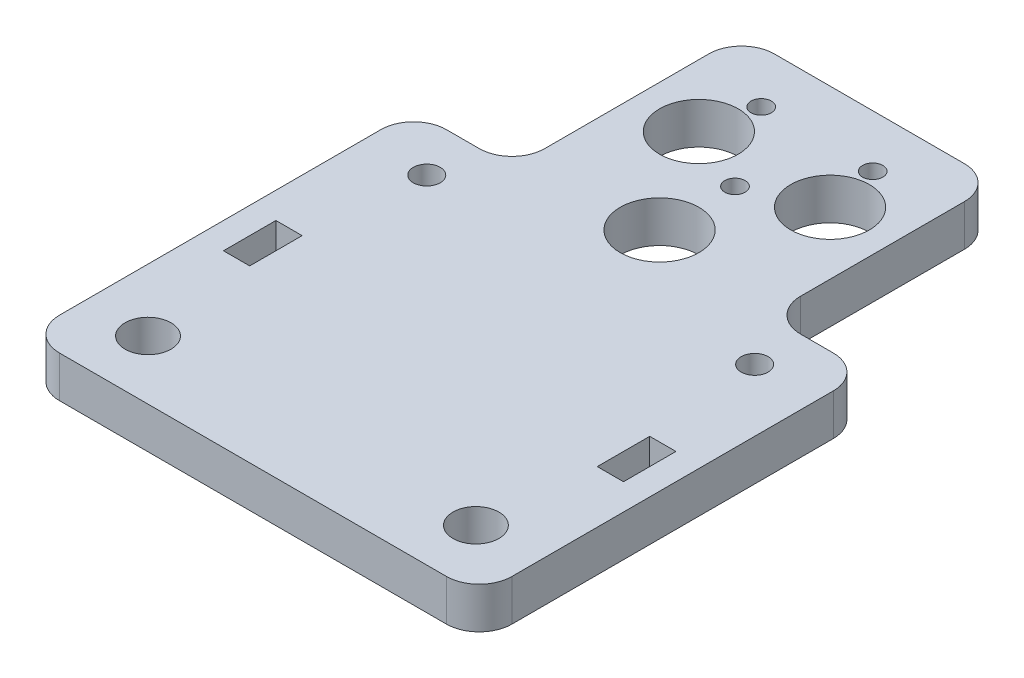
ISO-10303-21;
HEADER;
FILE_DESCRIPTION(('STEP AP214'),'2;1');
FILE_NAME('part.step','',(''),(''),'','','');
FILE_SCHEMA(('AUTOMOTIVE_DESIGN { 1 0 10303 214 1 1 1 1 }'));
ENDSEC;
DATA;
#1=APPLICATION_CONTEXT('core data for automotive mechanical design processes');
#2=APPLICATION_PROTOCOL_DEFINITION('international standard','automotive_design',2000,#1);
#3=PRODUCT_CONTEXT('',#1,'mechanical');
#4=PRODUCT('Part','Part','',(#3));
#5=PRODUCT_RELATED_PRODUCT_CATEGORY('part','',(#4));
#6=PRODUCT_DEFINITION_FORMATION('','',#4);
#7=PRODUCT_DEFINITION_CONTEXT('part definition',#1,'design');
#8=PRODUCT_DEFINITION('design','',#6,#7);
#9=PRODUCT_DEFINITION_SHAPE('','',#8);
#10=(LENGTH_UNIT() NAMED_UNIT(*) SI_UNIT(.MILLI.,.METRE.));
#11=(NAMED_UNIT(*) PLANE_ANGLE_UNIT() SI_UNIT($,.RADIAN.));
#12=(NAMED_UNIT(*) SI_UNIT($,.STERADIAN.) SOLID_ANGLE_UNIT());
#13=UNCERTAINTY_MEASURE_WITH_UNIT(LENGTH_MEASURE(1.E-05),#10,'distance_accuracy_value','');
#14=(GEOMETRIC_REPRESENTATION_CONTEXT(3) GLOBAL_UNCERTAINTY_ASSIGNED_CONTEXT((#13)) GLOBAL_UNIT_ASSIGNED_CONTEXT((#10,
#11,#12)) REPRESENTATION_CONTEXT('',''));
#15=CARTESIAN_POINT('',(0.,0.,0.));
#16=DIRECTION('',(0.,0.,1.));
#17=DIRECTION('',(1.,0.,0.));
#18=AXIS2_PLACEMENT_3D('',#15,#16,#17);
#19=CARTESIAN_POINT('',(0.,6.3,0.));
#20=DIRECTION('',(0.,1.,0.));
#21=DIRECTION('',(0.,0.,1.));
#22=AXIS2_PLACEMENT_3D('',#19,#20,#21);
#23=PLANE('',#22);
#24=CARTESIAN_POINT('',(26.,6.3,-86.));
#25=DIRECTION('',(0.,1.,0.));
#26=DIRECTION('',(0.,0.,1.));
#27=AXIS2_PLACEMENT_3D('',#24,#25,#26);
#28=CIRCLE('',#27,1.55);
#29=CARTESIAN_POINT('',(26.,6.3,-84.45));
#30=VERTEX_POINT('',#29);
#31=EDGE_CURVE('E830',#30,#30,#28,.T.);
#32=ORIENTED_EDGE('',*,*,#31,.F.);
#33=EDGE_LOOP('',(#32));
#34=FACE_BOUND('',#33,.T.);
#35=CARTESIAN_POINT('',(34.5,6.3,-62.));
#36=DIRECTION('',(0.,1.,0.));
#37=DIRECTION('',(0.,0.,1.));
#38=AXIS2_PLACEMENT_3D('',#35,#36,#37);
#39=CIRCLE('',#38,6.);
#40=CARTESIAN_POINT('',(34.5,6.3,-56.));
#41=VERTEX_POINT('',#40);
#42=EDGE_CURVE('E838',#41,#41,#39,.T.);
#43=ORIENTED_EDGE('',*,*,#42,.F.);
#44=EDGE_LOOP('',(#43));
#45=FACE_BOUND('',#44,.T.);
#46=CARTESIAN_POINT('',(24.5,6.3,-78.));
#47=DIRECTION('',(0.,1.,0.));
#48=DIRECTION('',(0.,0.,1.));
#49=AXIS2_PLACEMENT_3D('',#46,#47,#48);
#50=CIRCLE('',#49,6.);
#51=CARTESIAN_POINT('',(24.5,6.3,-72.));
#52=VERTEX_POINT('',#51);
#53=EDGE_CURVE('E846',#52,#52,#50,.T.);
#54=ORIENTED_EDGE('',*,*,#53,.F.);
#55=EDGE_LOOP('',(#54));
#56=FACE_BOUND('',#55,.T.);
#57=CARTESIAN_POINT('',(9.5,6.3,-9.));
#58=DIRECTION('',(0.,1.,0.));
#59=DIRECTION('',(0.,0.,1.));
#60=AXIS2_PLACEMENT_3D('',#57,#58,#59);
#61=CIRCLE('',#60,3.5);
#62=CARTESIAN_POINT('',(9.5,6.3,-5.5));
#63=VERTEX_POINT('',#62);
#64=EDGE_CURVE('E854',#63,#63,#61,.T.);
#65=ORIENTED_EDGE('',*,*,#64,.F.);
#66=EDGE_LOOP('',(#65));
#67=FACE_BOUND('',#66,.T.);
#68=CARTESIAN_POINT('',(9.5,6.3,-51.5));
#69=DIRECTION('',(0.,1.,0.));
#70=DIRECTION('',(0.,0.,1.));
#71=AXIS2_PLACEMENT_3D('',#68,#69,#70);
#72=CIRCLE('',#71,2.05);
#73=CARTESIAN_POINT('',(9.5,6.3,-49.45));
#74=VERTEX_POINT('',#73);
#75=EDGE_CURVE('E228',#74,#74,#72,.T.);
#76=ORIENTED_EDGE('',*,*,#75,.F.);
#77=EDGE_LOOP('',(#76));
#78=FACE_BOUND('',#77,.T.);
#79=DIRECTION('',(1.,0.,0.));
#80=VECTOR('',#79,1.);
#81=CARTESIAN_POINT('',(0.,6.3,0.));
#82=LINE('',#81,#80);
#83=CARTESIAN_POINT('',(5.,6.3,0.));
#84=VERTEX_POINT('',#83);
#85=CARTESIAN_POINT('',(64.,6.3,0.));
#86=VERTEX_POINT('',#85);
#87=EDGE_CURVE('E273',#84,#86,#82,.T.);
#88=ORIENTED_EDGE('',*,*,#87,.T.);
#89=CARTESIAN_POINT('',(64.,6.3,-5.));
#90=DIRECTION('',(0.,1.,0.));
#91=DIRECTION('',(0.,0.,1.));
#92=AXIS2_PLACEMENT_3D('',#89,#90,#91);
#93=CIRCLE('',#92,5.);
#94=CARTESIAN_POINT('',(69.,6.3,-5.));
#95=VERTEX_POINT('',#94);
#96=EDGE_CURVE('E356',#86,#95,#93,.T.);
#97=ORIENTED_EDGE('',*,*,#96,.T.);
#98=DIRECTION('',(0.,0.,-1.));
#99=VECTOR('',#98,1.);
#100=CARTESIAN_POINT('',(69.,6.3,0.));
#101=LINE('',#100,#99);
#102=CARTESIAN_POINT('',(69.,6.3,-54.));
#103=VERTEX_POINT('',#102);
#104=EDGE_CURVE('E277',#95,#103,#101,.T.);
#105=ORIENTED_EDGE('',*,*,#104,.T.);
#106=CARTESIAN_POINT('',(64.,6.3,-54.));
#107=DIRECTION('',(0.,1.,0.));
#108=DIRECTION('',(0.,0.,1.));
#109=AXIS2_PLACEMENT_3D('',#106,#107,#108);
#110=CIRCLE('',#109,5.);
#111=CARTESIAN_POINT('',(64.,6.3,-59.));
#112=VERTEX_POINT('',#111);
#113=EDGE_CURVE('E354',#103,#112,#110,.T.);
#114=ORIENTED_EDGE('',*,*,#113,.T.);
#115=DIRECTION('',(-1.,0.,0.));
#116=VECTOR('',#115,1.);
#117=CARTESIAN_POINT('',(54.,6.3,-59.));
#118=LINE('',#117,#116);
#119=CARTESIAN_POINT('',(59.,6.3,-59.));
#120=VERTEX_POINT('',#119);
#121=EDGE_CURVE('E280',#112,#120,#118,.T.);
#122=ORIENTED_EDGE('',*,*,#121,.T.);
#123=CARTESIAN_POINT('',(59.,6.3,-64.));
#124=DIRECTION('',(0.,1.,0.));
#125=DIRECTION('',(0.,0.,1.));
#126=AXIS2_PLACEMENT_3D('',#123,#124,#125);
#127=CIRCLE('',#126,5.);
#128=CARTESIAN_POINT('',(54.,6.3,-64.));
#129=VERTEX_POINT('',#128);
#130=EDGE_CURVE('E379',#120,#129,#127,.F.);
#131=ORIENTED_EDGE('',*,*,#130,.T.);
#132=DIRECTION('',(0.,0.,-1.));
#133=VECTOR('',#132,1.);
#134=CARTESIAN_POINT('',(54.,6.3,-94.));
#135=LINE('',#134,#133);
#136=CARTESIAN_POINT('',(54.,6.3,-89.));
#137=VERTEX_POINT('',#136);
#138=EDGE_CURVE('E283',#129,#137,#135,.T.);
#139=ORIENTED_EDGE('',*,*,#138,.T.);
#140=CARTESIAN_POINT('',(49.,6.3,-89.));
#141=DIRECTION('',(0.,1.,0.));
#142=DIRECTION('',(0.,0.,1.));
#143=AXIS2_PLACEMENT_3D('',#140,#141,#142);
#144=CIRCLE('',#143,5.);
#145=CARTESIAN_POINT('',(49.,6.3,-94.));
#146=VERTEX_POINT('',#145);
#147=EDGE_CURVE('E352',#137,#146,#144,.T.);
#148=ORIENTED_EDGE('',*,*,#147,.T.);
#149=DIRECTION('',(-1.,0.,0.));
#150=VECTOR('',#149,1.);
#151=CARTESIAN_POINT('',(15.,6.3,-94.));
#152=LINE('',#151,#150);
#153=CARTESIAN_POINT('',(20.,6.3,-94.));
#154=VERTEX_POINT('',#153);
#155=EDGE_CURVE('E286',#146,#154,#152,.T.);
#156=ORIENTED_EDGE('',*,*,#155,.T.);
#157=CARTESIAN_POINT('',(20.,6.3,-89.));
#158=DIRECTION('',(0.,1.,0.));
#159=DIRECTION('',(0.,0.,1.));
#160=AXIS2_PLACEMENT_3D('',#157,#158,#159);
#161=CIRCLE('',#160,5.);
#162=CARTESIAN_POINT('',(15.,6.3,-89.));
#163=VERTEX_POINT('',#162);
#164=EDGE_CURVE('E350',#154,#163,#161,.T.);
#165=ORIENTED_EDGE('',*,*,#164,.T.);
#166=DIRECTION('',(0.,0.,1.));
#167=VECTOR('',#166,1.);
#168=CARTESIAN_POINT('',(15.,6.3,-94.));
#169=LINE('',#168,#167);
#170=CARTESIAN_POINT('',(15.,6.3,-64.));
#171=VERTEX_POINT('',#170);
#172=EDGE_CURVE('E289',#163,#171,#169,.T.);
#173=ORIENTED_EDGE('',*,*,#172,.T.);
#174=CARTESIAN_POINT('',(10.,6.3,-64.));
#175=DIRECTION('',(0.,1.,0.));
#176=DIRECTION('',(0.,0.,1.));
#177=AXIS2_PLACEMENT_3D('',#174,#175,#176);
#178=CIRCLE('',#177,5.);
#179=CARTESIAN_POINT('',(10.,6.3,-59.));
#180=VERTEX_POINT('',#179);
#181=EDGE_CURVE('E11',#171,#180,#178,.F.);
#182=ORIENTED_EDGE('',*,*,#181,.T.);
#183=DIRECTION('',(-1.,0.,0.));
#184=VECTOR('',#183,1.);
#185=CARTESIAN_POINT('',(15.,6.3,-59.));
#186=LINE('',#185,#184);
#187=CARTESIAN_POINT('',(5.,6.3,-59.));
#188=VERTEX_POINT('',#187);
#189=EDGE_CURVE('E291',#180,#188,#186,.T.);
#190=ORIENTED_EDGE('',*,*,#189,.T.);
#191=CARTESIAN_POINT('',(5.,6.3,-54.));
#192=DIRECTION('',(0.,1.,0.));
#193=DIRECTION('',(0.,0.,1.));
#194=AXIS2_PLACEMENT_3D('',#191,#192,#193);
#195=CIRCLE('',#194,5.);
#196=CARTESIAN_POINT('',(0.,6.3,-54.));
#197=VERTEX_POINT('',#196);
#198=EDGE_CURVE('E348',#188,#197,#195,.T.);
#199=ORIENTED_EDGE('',*,*,#198,.T.);
#200=DIRECTION('',(0.,0.,1.));
#201=VECTOR('',#200,1.);
#202=CARTESIAN_POINT('',(0.,6.3,0.));
#203=LINE('',#202,#201);
#204=CARTESIAN_POINT('',(0.,6.3,-5.));
#205=VERTEX_POINT('',#204);
#206=EDGE_CURVE('E270',#197,#205,#203,.T.);
#207=ORIENTED_EDGE('',*,*,#206,.T.);
#208=CARTESIAN_POINT('',(5.,6.3,-5.));
#209=DIRECTION('',(0.,1.,0.));
#210=DIRECTION('',(0.,0.,1.));
#211=AXIS2_PLACEMENT_3D('',#208,#209,#210);
#212=CIRCLE('',#211,5.);
#213=EDGE_CURVE('E346',#205,#84,#212,.T.);
#214=ORIENTED_EDGE('',*,*,#213,.T.);
#215=EDGE_LOOP('',(#88,#97,#105,#114,#122,#131,#139,#148,#156,#165,#173,#182,#190,#199,#207,#214));
#216=FACE_BOUND('',#215,.T.);
#217=DIRECTION('',(1.,0.,0.));
#218=VECTOR('',#217,1.);
#219=CARTESIAN_POINT('',(4.,6.3,-26.));
#220=LINE('',#219,#218);
#221=CARTESIAN_POINT('',(4.,6.3,-26.));
#222=VERTEX_POINT('',#221);
#223=CARTESIAN_POINT('',(8.,6.3,-26.));
#224=VERTEX_POINT('',#223);
#225=EDGE_CURVE('E241',#222,#224,#220,.T.);
#226=ORIENTED_EDGE('',*,*,#225,.F.);
#227=DIRECTION('',(0.,0.,1.));
#228=VECTOR('',#227,1.);
#229=CARTESIAN_POINT('',(4.,6.3,-34.));
#230=LINE('',#229,#228);
#231=CARTESIAN_POINT('',(4.,6.3,-34.));
#232=VERTEX_POINT('',#231);
#233=EDGE_CURVE('E239',#232,#222,#230,.T.);
#234=ORIENTED_EDGE('',*,*,#233,.F.);
#235=DIRECTION('',(-1.,0.,0.));
#236=VECTOR('',#235,1.);
#237=CARTESIAN_POINT('',(4.,6.3,-34.));
#238=LINE('',#237,#236);
#239=CARTESIAN_POINT('',(8.,6.3,-34.));
#240=VERTEX_POINT('',#239);
#241=EDGE_CURVE('E247',#240,#232,#238,.T.);
#242=ORIENTED_EDGE('',*,*,#241,.F.);
#243=DIRECTION('',(0.,0.,-1.));
#244=VECTOR('',#243,1.);
#245=CARTESIAN_POINT('',(8.,6.3,-34.));
#246=LINE('',#245,#244);
#247=EDGE_CURVE('E244',#224,#240,#246,.T.);
#248=ORIENTED_EDGE('',*,*,#247,.F.);
#249=EDGE_LOOP('',(#226,#234,#242,#248));
#250=FACE_BOUND('',#249,.T.);
#251=DIRECTION('',(-1.,0.,0.));
#252=VECTOR('',#251,1.);
#253=CARTESIAN_POINT('',(65.,6.3,-34.));
#254=LINE('',#253,#252);
#255=CARTESIAN_POINT('',(65.,6.3,-34.));
#256=VERTEX_POINT('',#255);
#257=CARTESIAN_POINT('',(61.,6.3,-34.));
#258=VERTEX_POINT('',#257);
#259=EDGE_CURVE('E205',#256,#258,#254,.T.);
#260=ORIENTED_EDGE('',*,*,#259,.F.);
#261=DIRECTION('',(0.,0.,-1.));
#262=VECTOR('',#261,1.);
#263=CARTESIAN_POINT('',(65.,6.3,-34.));
#264=LINE('',#263,#262);
#265=CARTESIAN_POINT('',(65.,6.3,-26.));
#266=VERTEX_POINT('',#265);
#267=EDGE_CURVE('E195',#266,#256,#264,.T.);
#268=ORIENTED_EDGE('',*,*,#267,.F.);
#269=DIRECTION('',(1.,0.,0.));
#270=VECTOR('',#269,1.);
#271=CARTESIAN_POINT('',(65.,6.3,-26.));
#272=LINE('',#271,#270);
#273=CARTESIAN_POINT('',(61.,6.3,-26.));
#274=VERTEX_POINT('',#273);
#275=EDGE_CURVE('E221',#274,#266,#272,.T.);
#276=ORIENTED_EDGE('',*,*,#275,.F.);
#277=DIRECTION('',(0.,0.,1.));
#278=VECTOR('',#277,1.);
#279=CARTESIAN_POINT('',(61.,6.3,-34.));
#280=LINE('',#279,#278);
#281=EDGE_CURVE('E219',#258,#274,#280,.T.);
#282=ORIENTED_EDGE('',*,*,#281,.F.);
#283=EDGE_LOOP('',(#260,#268,#276,#282));
#284=FACE_BOUND('',#283,.T.);
#285=CARTESIAN_POINT('',(59.5,6.3,-51.5));
#286=DIRECTION('',(0.,1.,0.));
#287=DIRECTION('',(0.,0.,1.));
#288=AXIS2_PLACEMENT_3D('',#285,#286,#287);
#289=CIRCLE('',#288,2.04999999999999);
#290=CARTESIAN_POINT('',(59.5,6.3,-49.45));
#291=VERTEX_POINT('',#290);
#292=EDGE_CURVE('E858',#291,#291,#289,.T.);
#293=ORIENTED_EDGE('',*,*,#292,.F.);
#294=EDGE_LOOP('',(#293));
#295=FACE_BOUND('',#294,.T.);
#296=CARTESIAN_POINT('',(59.5,6.3,-9.));
#297=DIRECTION('',(0.,1.,0.));
#298=DIRECTION('',(0.,0.,1.));
#299=AXIS2_PLACEMENT_3D('',#296,#297,#298);
#300=CIRCLE('',#299,3.50000000000001);
#301=CARTESIAN_POINT('',(59.5,6.3,-5.49999999999999));
#302=VERTEX_POINT('',#301);
#303=EDGE_CURVE('E850',#302,#302,#300,.T.);
#304=ORIENTED_EDGE('',*,*,#303,.F.);
#305=EDGE_LOOP('',(#304));
#306=FACE_BOUND('',#305,.T.);
#307=CARTESIAN_POINT('',(44.5,6.3,-78.));
#308=DIRECTION('',(0.,1.,0.));
#309=DIRECTION('',(0.,0.,1.));
#310=AXIS2_PLACEMENT_3D('',#307,#308,#309);
#311=CIRCLE('',#310,6.);
#312=CARTESIAN_POINT('',(44.5,6.3,-72.));
#313=VERTEX_POINT('',#312);
#314=EDGE_CURVE('E842',#313,#313,#311,.T.);
#315=ORIENTED_EDGE('',*,*,#314,.F.);
#316=EDGE_LOOP('',(#315));
#317=FACE_BOUND('',#316,.T.);
#318=CARTESIAN_POINT('',(34.5,6.3,-73.5));
#319=DIRECTION('',(0.,1.,0.));
#320=DIRECTION('',(0.,0.,1.));
#321=AXIS2_PLACEMENT_3D('',#318,#319,#320);
#322=CIRCLE('',#321,1.55);
#323=CARTESIAN_POINT('',(34.5,6.3,-71.95));
#324=VERTEX_POINT('',#323);
#325=EDGE_CURVE('E834',#324,#324,#322,.T.);
#326=ORIENTED_EDGE('',*,*,#325,.F.);
#327=EDGE_LOOP('',(#326));
#328=FACE_BOUND('',#327,.T.);
#329=CARTESIAN_POINT('',(43.,6.3,-86.));
#330=DIRECTION('',(0.,1.,0.));
#331=DIRECTION('',(0.,0.,1.));
#332=AXIS2_PLACEMENT_3D('',#329,#330,#331);
#333=CIRCLE('',#332,1.55);
#334=CARTESIAN_POINT('',(43.,6.3,-84.45));
#335=VERTEX_POINT('',#334);
#336=EDGE_CURVE('E825',#335,#335,#333,.T.);
#337=ORIENTED_EDGE('',*,*,#336,.F.);
#338=EDGE_LOOP('',(#337));
#339=FACE_BOUND('',#338,.T.);
#340=ADVANCED_FACE('F33',(#34,#45,#56,#67,#78,#216,#250,#284,#295,#306,#317,#328,#339),#23,.T.);
#341=CARTESIAN_POINT('',(0.,0.,0.));
#342=DIRECTION('',(0.,1.,0.));
#343=DIRECTION('',(0.,0.,1.));
#344=AXIS2_PLACEMENT_3D('',#341,#342,#343);
#345=PLANE('',#344);
#346=DIRECTION('',(0.,0.,1.));
#347=VECTOR('',#346,1.);
#348=CARTESIAN_POINT('',(4.,0.,-34.));
#349=LINE('',#348,#347);
#350=CARTESIAN_POINT('',(4.,0.,-34.));
#351=VERTEX_POINT('',#350);
#352=CARTESIAN_POINT('',(4.,0.,-26.));
#353=VERTEX_POINT('',#352);
#354=EDGE_CURVE('E213',#351,#353,#349,.T.);
#355=ORIENTED_EDGE('',*,*,#354,.T.);
#356=DIRECTION('',(1.,0.,0.));
#357=VECTOR('',#356,1.);
#358=CARTESIAN_POINT('',(4.,0.,-26.));
#359=LINE('',#358,#357);
#360=CARTESIAN_POINT('',(8.,0.,-26.));
#361=VERTEX_POINT('',#360);
#362=EDGE_CURVE('E252',#353,#361,#359,.T.);
#363=ORIENTED_EDGE('',*,*,#362,.T.);
#364=DIRECTION('',(0.,0.,-1.));
#365=VECTOR('',#364,1.);
#366=CARTESIAN_POINT('',(8.,0.,-34.));
#367=LINE('',#366,#365);
#368=CARTESIAN_POINT('',(8.,0.,-34.));
#369=VERTEX_POINT('',#368);
#370=EDGE_CURVE('E255',#361,#369,#367,.T.);
#371=ORIENTED_EDGE('',*,*,#370,.T.);
#372=DIRECTION('',(-1.,0.,0.));
#373=VECTOR('',#372,1.);
#374=CARTESIAN_POINT('',(4.,0.,-34.));
#375=LINE('',#374,#373);
#376=EDGE_CURVE('E242',#369,#351,#375,.T.);
#377=ORIENTED_EDGE('',*,*,#376,.T.);
#378=EDGE_LOOP('',(#355,#363,#371,#377));
#379=FACE_BOUND('',#378,.T.);
#380=DIRECTION('',(0.,0.,-1.));
#381=VECTOR('',#380,1.);
#382=CARTESIAN_POINT('',(69.,0.,0.));
#383=LINE('',#382,#381);
#384=CARTESIAN_POINT('',(69.,0.,-5.));
#385=VERTEX_POINT('',#384);
#386=CARTESIAN_POINT('',(69.,0.,-54.));
#387=VERTEX_POINT('',#386);
#388=EDGE_CURVE('E299',#385,#387,#383,.T.);
#389=ORIENTED_EDGE('',*,*,#388,.F.);
#390=CARTESIAN_POINT('',(64.,0.,-5.));
#391=DIRECTION('',(0.,1.,0.));
#392=DIRECTION('',(0.,0.,1.));
#393=AXIS2_PLACEMENT_3D('',#390,#391,#392);
#394=CIRCLE('',#393,5.);
#395=CARTESIAN_POINT('',(64.,0.,0.));
#396=VERTEX_POINT('',#395);
#397=EDGE_CURVE('E339',#385,#396,#394,.F.);
#398=ORIENTED_EDGE('',*,*,#397,.T.);
#399=DIRECTION('',(1.,0.,0.));
#400=VECTOR('',#399,1.);
#401=CARTESIAN_POINT('',(0.,0.,0.));
#402=LINE('',#401,#400);
#403=CARTESIAN_POINT('',(5.,0.,0.));
#404=VERTEX_POINT('',#403);
#405=EDGE_CURVE('E296',#404,#396,#402,.T.);
#406=ORIENTED_EDGE('',*,*,#405,.F.);
#407=CARTESIAN_POINT('',(5.,0.,-5.));
#408=DIRECTION('',(0.,1.,0.));
#409=DIRECTION('',(0.,0.,1.));
#410=AXIS2_PLACEMENT_3D('',#407,#408,#409);
#411=CIRCLE('',#410,5.);
#412=CARTESIAN_POINT('',(0.,0.,-5.));
#413=VERTEX_POINT('',#412);
#414=EDGE_CURVE('E329',#404,#413,#411,.F.);
#415=ORIENTED_EDGE('',*,*,#414,.T.);
#416=DIRECTION('',(0.,0.,1.));
#417=VECTOR('',#416,1.);
#418=CARTESIAN_POINT('',(0.,0.,0.));
#419=LINE('',#418,#417);
#420=CARTESIAN_POINT('',(0.,0.,-54.));
#421=VERTEX_POINT('',#420);
#422=EDGE_CURVE('E269',#421,#413,#419,.T.);
#423=ORIENTED_EDGE('',*,*,#422,.F.);
#424=CARTESIAN_POINT('',(5.,0.,-54.));
#425=DIRECTION('',(0.,1.,0.));
#426=DIRECTION('',(0.,0.,1.));
#427=AXIS2_PLACEMENT_3D('',#424,#425,#426);
#428=CIRCLE('',#427,5.);
#429=CARTESIAN_POINT('',(5.,0.,-59.));
#430=VERTEX_POINT('',#429);
#431=EDGE_CURVE('E331',#421,#430,#428,.F.);
#432=ORIENTED_EDGE('',*,*,#431,.T.);
#433=DIRECTION('',(-1.,0.,0.));
#434=VECTOR('',#433,1.);
#435=CARTESIAN_POINT('',(15.,0.,-59.));
#436=LINE('',#435,#434);
#437=CARTESIAN_POINT('',(10.,0.,-59.));
#438=VERTEX_POINT('',#437);
#439=EDGE_CURVE('E274',#438,#430,#436,.T.);
#440=ORIENTED_EDGE('',*,*,#439,.F.);
#441=CARTESIAN_POINT('',(10.,0.,-64.));
#442=DIRECTION('',(0.,1.,0.));
#443=DIRECTION('',(0.,0.,1.));
#444=AXIS2_PLACEMENT_3D('',#441,#442,#443);
#445=CIRCLE('',#444,5.);
#446=CARTESIAN_POINT('',(15.,0.,-64.));
#447=VERTEX_POINT('',#446);
#448=EDGE_CURVE('E41',#438,#447,#445,.T.);
#449=ORIENTED_EDGE('',*,*,#448,.T.);
#450=DIRECTION('',(0.,0.,1.));
#451=VECTOR('',#450,1.);
#452=CARTESIAN_POINT('',(15.,0.,-94.));
#453=LINE('',#452,#451);
#454=CARTESIAN_POINT('',(15.,0.,-89.));
#455=VERTEX_POINT('',#454);
#456=EDGE_CURVE('E311',#455,#447,#453,.T.);
#457=ORIENTED_EDGE('',*,*,#456,.F.);
#458=CARTESIAN_POINT('',(20.,0.,-89.));
#459=DIRECTION('',(0.,1.,0.));
#460=DIRECTION('',(0.,0.,1.));
#461=AXIS2_PLACEMENT_3D('',#458,#459,#460);
#462=CIRCLE('',#461,5.);
#463=CARTESIAN_POINT('',(20.,0.,-94.));
#464=VERTEX_POINT('',#463);
#465=EDGE_CURVE('E333',#455,#464,#462,.F.);
#466=ORIENTED_EDGE('',*,*,#465,.T.);
#467=DIRECTION('',(-1.,0.,0.));
#468=VECTOR('',#467,1.);
#469=CARTESIAN_POINT('',(15.,0.,-94.));
#470=LINE('',#469,#468);
#471=CARTESIAN_POINT('',(49.,0.,-94.));
#472=VERTEX_POINT('',#471);
#473=EDGE_CURVE('E308',#472,#464,#470,.T.);
#474=ORIENTED_EDGE('',*,*,#473,.F.);
#475=CARTESIAN_POINT('',(49.,0.,-89.));
#476=DIRECTION('',(0.,1.,0.));
#477=DIRECTION('',(0.,0.,1.));
#478=AXIS2_PLACEMENT_3D('',#475,#476,#477);
#479=CIRCLE('',#478,5.);
#480=CARTESIAN_POINT('',(54.,0.,-89.));
#481=VERTEX_POINT('',#480);
#482=EDGE_CURVE('E335',#472,#481,#479,.F.);
#483=ORIENTED_EDGE('',*,*,#482,.T.);
#484=DIRECTION('',(0.,0.,-1.));
#485=VECTOR('',#484,1.);
#486=CARTESIAN_POINT('',(54.,0.,-94.));
#487=LINE('',#486,#485);
#488=CARTESIAN_POINT('',(54.,0.,-64.));
#489=VERTEX_POINT('',#488);
#490=EDGE_CURVE('E305',#489,#481,#487,.T.);
#491=ORIENTED_EDGE('',*,*,#490,.F.);
#492=CARTESIAN_POINT('',(59.,0.,-64.));
#493=DIRECTION('',(0.,1.,0.));
#494=DIRECTION('',(0.,0.,1.));
#495=AXIS2_PLACEMENT_3D('',#492,#493,#494);
#496=CIRCLE('',#495,5.);
#497=CARTESIAN_POINT('',(59.,0.,-59.));
#498=VERTEX_POINT('',#497);
#499=EDGE_CURVE('E377',#489,#498,#496,.T.);
#500=ORIENTED_EDGE('',*,*,#499,.T.);
#501=DIRECTION('',(-1.,0.,0.));
#502=VECTOR('',#501,1.);
#503=CARTESIAN_POINT('',(54.,0.,-59.));
#504=LINE('',#503,#502);
#505=CARTESIAN_POINT('',(64.,0.,-59.));
#506=VERTEX_POINT('',#505);
#507=EDGE_CURVE('E302',#506,#498,#504,.T.);
#508=ORIENTED_EDGE('',*,*,#507,.F.);
#509=CARTESIAN_POINT('',(64.,0.,-54.));
#510=DIRECTION('',(0.,1.,0.));
#511=DIRECTION('',(0.,0.,1.));
#512=AXIS2_PLACEMENT_3D('',#509,#510,#511);
#513=CIRCLE('',#512,5.);
#514=EDGE_CURVE('E337',#506,#387,#513,.F.);
#515=ORIENTED_EDGE('',*,*,#514,.T.);
#516=EDGE_LOOP('',(#389,#398,#406,#415,#423,#432,#440,#449,#457,#466,#474,#483,#491,#500,#508,#515));
#517=FACE_BOUND('',#516,.T.);
#518=DIRECTION('',(0.,0.,-1.));
#519=VECTOR('',#518,1.);
#520=CARTESIAN_POINT('',(65.,0.,-34.));
#521=LINE('',#520,#519);
#522=CARTESIAN_POINT('',(65.,0.,-26.));
#523=VERTEX_POINT('',#522);
#524=CARTESIAN_POINT('',(65.,0.,-34.));
#525=VERTEX_POINT('',#524);
#526=EDGE_CURVE('E226',#523,#525,#521,.T.);
#527=ORIENTED_EDGE('',*,*,#526,.T.);
#528=DIRECTION('',(-1.,0.,0.));
#529=VECTOR('',#528,1.);
#530=CARTESIAN_POINT('',(65.,0.,-34.));
#531=LINE('',#530,#529);
#532=CARTESIAN_POINT('',(61.,0.,-34.));
#533=VERTEX_POINT('',#532);
#534=EDGE_CURVE('E212',#525,#533,#531,.T.);
#535=ORIENTED_EDGE('',*,*,#534,.T.);
#536=DIRECTION('',(0.,0.,1.));
#537=VECTOR('',#536,1.);
#538=CARTESIAN_POINT('',(61.,0.,-34.));
#539=LINE('',#538,#537);
#540=CARTESIAN_POINT('',(61.,0.,-26.));
#541=VERTEX_POINT('',#540);
#542=EDGE_CURVE('E230',#533,#541,#539,.T.);
#543=ORIENTED_EDGE('',*,*,#542,.T.);
#544=DIRECTION('',(1.,0.,0.));
#545=VECTOR('',#544,1.);
#546=CARTESIAN_POINT('',(65.,0.,-26.));
#547=LINE('',#546,#545);
#548=EDGE_CURVE('E206',#541,#523,#547,.T.);
#549=ORIENTED_EDGE('',*,*,#548,.T.);
#550=EDGE_LOOP('',(#527,#535,#543,#549));
#551=FACE_BOUND('',#550,.T.);
#552=CARTESIAN_POINT('',(9.5,0.,-51.5));
#553=DIRECTION('',(0.,1.,0.));
#554=DIRECTION('',(0.,0.,1.));
#555=AXIS2_PLACEMENT_3D('',#552,#553,#554);
#556=CIRCLE('',#555,2.05);
#557=CARTESIAN_POINT('',(9.5,0.,-49.45));
#558=VERTEX_POINT('',#557);
#559=EDGE_CURVE('E788',#558,#558,#556,.T.);
#560=ORIENTED_EDGE('',*,*,#559,.T.);
#561=EDGE_LOOP('',(#560));
#562=FACE_BOUND('',#561,.T.);
#563=CARTESIAN_POINT('',(59.5,0.,-51.5));
#564=DIRECTION('',(0.,1.,0.));
#565=DIRECTION('',(0.,0.,1.));
#566=AXIS2_PLACEMENT_3D('',#563,#564,#565);
#567=CIRCLE('',#566,2.04999999999999);
#568=CARTESIAN_POINT('',(59.5,0.,-49.45));
#569=VERTEX_POINT('',#568);
#570=EDGE_CURVE('E792',#569,#569,#567,.T.);
#571=ORIENTED_EDGE('',*,*,#570,.T.);
#572=EDGE_LOOP('',(#571));
#573=FACE_BOUND('',#572,.T.);
#574=CARTESIAN_POINT('',(9.5,0.,-9.));
#575=DIRECTION('',(0.,1.,0.));
#576=DIRECTION('',(0.,0.,1.));
#577=AXIS2_PLACEMENT_3D('',#574,#575,#576);
#578=CIRCLE('',#577,3.5);
#579=CARTESIAN_POINT('',(9.5,0.,-5.5));
#580=VERTEX_POINT('',#579);
#581=EDGE_CURVE('E796',#580,#580,#578,.T.);
#582=ORIENTED_EDGE('',*,*,#581,.T.);
#583=EDGE_LOOP('',(#582));
#584=FACE_BOUND('',#583,.T.);
#585=CARTESIAN_POINT('',(59.5,0.,-9.));
#586=DIRECTION('',(0.,1.,0.));
#587=DIRECTION('',(0.,0.,1.));
#588=AXIS2_PLACEMENT_3D('',#585,#586,#587);
#589=CIRCLE('',#588,3.50000000000001);
#590=CARTESIAN_POINT('',(59.5,0.,-5.49999999999999));
#591=VERTEX_POINT('',#590);
#592=EDGE_CURVE('E800',#591,#591,#589,.T.);
#593=ORIENTED_EDGE('',*,*,#592,.T.);
#594=EDGE_LOOP('',(#593));
#595=FACE_BOUND('',#594,.T.);
#596=CARTESIAN_POINT('',(24.5,0.,-78.));
#597=DIRECTION('',(0.,1.,0.));
#598=DIRECTION('',(0.,0.,1.));
#599=AXIS2_PLACEMENT_3D('',#596,#597,#598);
#600=CIRCLE('',#599,6.);
#601=CARTESIAN_POINT('',(24.5,0.,-72.));
#602=VERTEX_POINT('',#601);
#603=EDGE_CURVE('E804',#602,#602,#600,.T.);
#604=ORIENTED_EDGE('',*,*,#603,.T.);
#605=EDGE_LOOP('',(#604));
#606=FACE_BOUND('',#605,.T.);
#607=CARTESIAN_POINT('',(44.5,0.,-78.));
#608=DIRECTION('',(0.,1.,0.));
#609=DIRECTION('',(0.,0.,1.));
#610=AXIS2_PLACEMENT_3D('',#607,#608,#609);
#611=CIRCLE('',#610,6.);
#612=CARTESIAN_POINT('',(44.5,0.,-72.));
#613=VERTEX_POINT('',#612);
#614=EDGE_CURVE('E808',#613,#613,#611,.T.);
#615=ORIENTED_EDGE('',*,*,#614,.T.);
#616=EDGE_LOOP('',(#615));
#617=FACE_BOUND('',#616,.T.);
#618=CARTESIAN_POINT('',(34.5,0.,-62.));
#619=DIRECTION('',(0.,1.,0.));
#620=DIRECTION('',(0.,0.,1.));
#621=AXIS2_PLACEMENT_3D('',#618,#619,#620);
#622=CIRCLE('',#621,6.);
#623=CARTESIAN_POINT('',(34.5,0.,-56.));
#624=VERTEX_POINT('',#623);
#625=EDGE_CURVE('E812',#624,#624,#622,.T.);
#626=ORIENTED_EDGE('',*,*,#625,.T.);
#627=EDGE_LOOP('',(#626));
#628=FACE_BOUND('',#627,.T.);
#629=CARTESIAN_POINT('',(34.5,0.,-73.5));
#630=DIRECTION('',(0.,1.,0.));
#631=DIRECTION('',(0.,0.,1.));
#632=AXIS2_PLACEMENT_3D('',#629,#630,#631);
#633=CIRCLE('',#632,1.55);
#634=CARTESIAN_POINT('',(34.5,0.,-71.95));
#635=VERTEX_POINT('',#634);
#636=EDGE_CURVE('E816',#635,#635,#633,.T.);
#637=ORIENTED_EDGE('',*,*,#636,.T.);
#638=EDGE_LOOP('',(#637));
#639=FACE_BOUND('',#638,.T.);
#640=CARTESIAN_POINT('',(26.,0.,-86.));
#641=DIRECTION('',(0.,1.,0.));
#642=DIRECTION('',(0.,0.,1.));
#643=AXIS2_PLACEMENT_3D('',#640,#641,#642);
#644=CIRCLE('',#643,1.55);
#645=CARTESIAN_POINT('',(26.,0.,-84.45));
#646=VERTEX_POINT('',#645);
#647=EDGE_CURVE('E820',#646,#646,#644,.T.);
#648=ORIENTED_EDGE('',*,*,#647,.T.);
#649=EDGE_LOOP('',(#648));
#650=FACE_BOUND('',#649,.T.);
#651=CARTESIAN_POINT('',(43.,0.,-86.));
#652=DIRECTION('',(0.,1.,0.));
#653=DIRECTION('',(0.,0.,1.));
#654=AXIS2_PLACEMENT_3D('',#651,#652,#653);
#655=CIRCLE('',#654,1.55);
#656=CARTESIAN_POINT('',(43.,0.,-84.45));
#657=VERTEX_POINT('',#656);
#658=EDGE_CURVE('E823',#657,#657,#655,.T.);
#659=ORIENTED_EDGE('',*,*,#658,.T.);
#660=EDGE_LOOP('',(#659));
#661=FACE_BOUND('',#660,.T.);
#662=ADVANCED_FACE('F384',(#379,#517,#551,#562,#573,#584,#595,#606,#617,#628,#639,#650,#661),
#345,.F.);
#663=CARTESIAN_POINT('',(0.,6.3,0.));
#664=DIRECTION('',(1.,0.,0.));
#665=DIRECTION('',(0.,0.,-1.));
#666=AXIS2_PLACEMENT_3D('',#663,#664,#665);
#667=PLANE('',#666);
#668=ORIENTED_EDGE('',*,*,#206,.F.);
#669=DIRECTION('',(0.,-1.,0.));
#670=VECTOR('',#669,1.);
#671=CARTESIAN_POINT('',(0.,6.3,-54.));
#672=LINE('',#671,#670);
#673=EDGE_CURVE('E374',#197,#421,#672,.T.);
#674=ORIENTED_EDGE('',*,*,#673,.T.);
#675=ORIENTED_EDGE('',*,*,#422,.T.);
#676=DIRECTION('',(0.,-1.,0.));
#677=VECTOR('',#676,1.);
#678=CARTESIAN_POINT('',(0.,6.3,-5.));
#679=LINE('',#678,#677);
#680=EDGE_CURVE('E372',#413,#205,#679,.F.);
#681=ORIENTED_EDGE('',*,*,#680,.T.);
#682=EDGE_LOOP('',(#668,#674,#675,#681));
#683=FACE_BOUND('',#682,.T.);
#684=ADVANCED_FACE('F403',(#683),#667,.F.);
#685=CARTESIAN_POINT('',(0.,6.3,0.));
#686=DIRECTION('',(0.,0.,-1.));
#687=DIRECTION('',(-1.,0.,0.));
#688=AXIS2_PLACEMENT_3D('',#685,#686,#687);
#689=PLANE('',#688);
#690=ORIENTED_EDGE('',*,*,#405,.T.);
#691=DIRECTION('',(0.,-1.,0.));
#692=VECTOR('',#691,1.);
#693=CARTESIAN_POINT('',(64.,6.3,0.));
#694=LINE('',#693,#692);
#695=EDGE_CURVE('E344',#396,#86,#694,.F.);
#696=ORIENTED_EDGE('',*,*,#695,.T.);
#697=ORIENTED_EDGE('',*,*,#87,.F.);
#698=DIRECTION('',(0.,-1.,0.));
#699=VECTOR('',#698,1.);
#700=CARTESIAN_POINT('',(5.,6.3,0.));
#701=LINE('',#700,#699);
#702=EDGE_CURVE('E341',#84,#404,#701,.T.);
#703=ORIENTED_EDGE('',*,*,#702,.T.);
#704=EDGE_LOOP('',(#690,#696,#697,#703));
#705=FACE_BOUND('',#704,.T.);
#706=ADVANCED_FACE('F411',(#705),#689,.F.);
#707=CARTESIAN_POINT('',(69.,6.3,0.));
#708=DIRECTION('',(-1.,0.,0.));
#709=DIRECTION('',(0.,0.,1.));
#710=AXIS2_PLACEMENT_3D('',#707,#708,#709);
#711=PLANE('',#710);
#712=ORIENTED_EDGE('',*,*,#104,.F.);
#713=DIRECTION('',(0.,-1.,0.));
#714=VECTOR('',#713,1.);
#715=CARTESIAN_POINT('',(69.,6.3,-5.));
#716=LINE('',#715,#714);
#717=EDGE_CURVE('E326',#95,#385,#716,.T.);
#718=ORIENTED_EDGE('',*,*,#717,.T.);
#719=ORIENTED_EDGE('',*,*,#388,.T.);
#720=DIRECTION('',(0.,-1.,0.));
#721=VECTOR('',#720,1.);
#722=CARTESIAN_POINT('',(69.,6.3,-54.));
#723=LINE('',#722,#721);
#724=EDGE_CURVE('E324',#387,#103,#723,.F.);
#725=ORIENTED_EDGE('',*,*,#724,.T.);
#726=EDGE_LOOP('',(#712,#718,#719,#725));
#727=FACE_BOUND('',#726,.T.);
#728=ADVANCED_FACE('F419',(#727),#711,.F.);
#729=CARTESIAN_POINT('',(54.,6.3,-59.));
#730=DIRECTION('',(0.,0.,1.));
#731=DIRECTION('',(1.,0.,0.));
#732=AXIS2_PLACEMENT_3D('',#729,#730,#731);
#733=PLANE('',#732);
#734=ORIENTED_EDGE('',*,*,#507,.T.);
#735=DIRECTION('',(0.,-1.,0.));
#736=VECTOR('',#735,1.);
#737=CARTESIAN_POINT('',(59.,6.3,-59.));
#738=LINE('',#737,#736);
#739=EDGE_CURVE('E322',#498,#120,#738,.F.);
#740=ORIENTED_EDGE('',*,*,#739,.T.);
#741=ORIENTED_EDGE('',*,*,#121,.F.);
#742=DIRECTION('',(0.,-1.,0.));
#743=VECTOR('',#742,1.);
#744=CARTESIAN_POINT('',(64.,6.3,-59.));
#745=LINE('',#744,#743);
#746=EDGE_CURVE('E319',#112,#506,#745,.T.);
#747=ORIENTED_EDGE('',*,*,#746,.T.);
#748=EDGE_LOOP('',(#734,#740,#741,#747));
#749=FACE_BOUND('',#748,.T.);
#750=ADVANCED_FACE('F428',(#749),#733,.F.);
#751=CARTESIAN_POINT('',(54.,6.3,-94.));
#752=DIRECTION('',(-1.,0.,0.));
#753=DIRECTION('',(0.,0.,1.));
#754=AXIS2_PLACEMENT_3D('',#751,#752,#753);
#755=PLANE('',#754);
#756=ORIENTED_EDGE('',*,*,#138,.F.);
#757=DIRECTION('',(0.,-1.,0.));
#758=VECTOR('',#757,1.);
#759=CARTESIAN_POINT('',(54.,0.,-64.));
#760=LINE('',#759,#758);
#761=EDGE_CURVE('E316',#129,#489,#760,.T.);
#762=ORIENTED_EDGE('',*,*,#761,.T.);
#763=ORIENTED_EDGE('',*,*,#490,.T.);
#764=DIRECTION('',(0.,-1.,0.));
#765=VECTOR('',#764,1.);
#766=CARTESIAN_POINT('',(54.,6.3,-89.));
#767=LINE('',#766,#765);
#768=EDGE_CURVE('E293',#481,#137,#767,.F.);
#769=ORIENTED_EDGE('',*,*,#768,.T.);
#770=EDGE_LOOP('',(#756,#762,#763,#769));
#771=FACE_BOUND('',#770,.T.);
#772=ADVANCED_FACE('F437',(#771),#755,.F.);
#773=CARTESIAN_POINT('',(15.,6.3,-94.));
#774=DIRECTION('',(0.,0.,1.));
#775=DIRECTION('',(1.,0.,0.));
#776=AXIS2_PLACEMENT_3D('',#773,#774,#775);
#777=PLANE('',#776);
#778=ORIENTED_EDGE('',*,*,#155,.F.);
#779=DIRECTION('',(0.,-1.,0.));
#780=VECTOR('',#779,1.);
#781=CARTESIAN_POINT('',(49.,6.3,-94.));
#782=LINE('',#781,#780);
#783=EDGE_CURVE('E360',#146,#472,#782,.T.);
#784=ORIENTED_EDGE('',*,*,#783,.T.);
#785=ORIENTED_EDGE('',*,*,#473,.T.);
#786=DIRECTION('',(0.,-1.,0.));
#787=VECTOR('',#786,1.);
#788=CARTESIAN_POINT('',(20.,6.3,-94.));
#789=LINE('',#788,#787);
#790=EDGE_CURVE('E358',#464,#154,#789,.F.);
#791=ORIENTED_EDGE('',*,*,#790,.T.);
#792=EDGE_LOOP('',(#778,#784,#785,#791));
#793=FACE_BOUND('',#792,.T.);
#794=ADVANCED_FACE('F446',(#793),#777,.F.);
#795=CARTESIAN_POINT('',(15.,6.3,-94.));
#796=DIRECTION('',(1.,0.,0.));
#797=DIRECTION('',(0.,0.,-1.));
#798=AXIS2_PLACEMENT_3D('',#795,#796,#797);
#799=PLANE('',#798);
#800=ORIENTED_EDGE('',*,*,#456,.T.);
#801=DIRECTION('',(0.,-1.,0.));
#802=VECTOR('',#801,1.);
#803=CARTESIAN_POINT('',(15.,6.3,-64.));
#804=LINE('',#803,#802);
#805=EDGE_CURVE('E370',#447,#171,#804,.F.);
#806=ORIENTED_EDGE('',*,*,#805,.T.);
#807=ORIENTED_EDGE('',*,*,#172,.F.);
#808=DIRECTION('',(0.,-1.,0.));
#809=VECTOR('',#808,1.);
#810=CARTESIAN_POINT('',(15.,6.3,-89.));
#811=LINE('',#810,#809);
#812=EDGE_CURVE('E367',#163,#455,#811,.T.);
#813=ORIENTED_EDGE('',*,*,#812,.T.);
#814=EDGE_LOOP('',(#800,#806,#807,#813));
#815=FACE_BOUND('',#814,.T.);
#816=ADVANCED_FACE('F390',(#815),#799,.F.);
#817=CARTESIAN_POINT('',(15.,6.3,-59.));
#818=DIRECTION('',(0.,0.,1.));
#819=DIRECTION('',(1.,0.,0.));
#820=AXIS2_PLACEMENT_3D('',#817,#818,#819);
#821=PLANE('',#820);
#822=ORIENTED_EDGE('',*,*,#189,.F.);
#823=DIRECTION('',(0.,-1.,0.));
#824=VECTOR('',#823,1.);
#825=CARTESIAN_POINT('',(10.,0.,-59.));
#826=LINE('',#825,#824);
#827=EDGE_CURVE('E364',#180,#438,#826,.T.);
#828=ORIENTED_EDGE('',*,*,#827,.T.);
#829=ORIENTED_EDGE('',*,*,#439,.T.);
#830=DIRECTION('',(0.,-1.,0.));
#831=VECTOR('',#830,1.);
#832=CARTESIAN_POINT('',(5.,6.3,-59.));
#833=LINE('',#832,#831);
#834=EDGE_CURVE('E48',#430,#188,#833,.F.);
#835=ORIENTED_EDGE('',*,*,#834,.T.);
#836=EDGE_LOOP('',(#822,#828,#829,#835));
#837=FACE_BOUND('',#836,.T.);
#838=ADVANCED_FACE('F394',(#837),#821,.F.);
#839=CARTESIAN_POINT('',(4.,6.3,-34.));
#840=DIRECTION('',(1.,0.,0.));
#841=DIRECTION('',(0.,0.,-1.));
#842=AXIS2_PLACEMENT_3D('',#839,#840,#841);
#843=PLANE('',#842);
#844=ORIENTED_EDGE('',*,*,#354,.F.);
#845=DIRECTION('',(0.,-1.,0.));
#846=VECTOR('',#845,1.);
#847=CARTESIAN_POINT('',(4.,6.3,-34.));
#848=LINE('',#847,#846);
#849=EDGE_CURVE('E249',#232,#351,#848,.T.);
#850=ORIENTED_EDGE('',*,*,#849,.F.);
#851=ORIENTED_EDGE('',*,*,#233,.T.);
#852=DIRECTION('',(0.,-1.,0.));
#853=VECTOR('',#852,1.);
#854=CARTESIAN_POINT('',(4.,6.3,-26.));
#855=LINE('',#854,#853);
#856=EDGE_CURVE('E266',#222,#353,#855,.T.);
#857=ORIENTED_EDGE('',*,*,#856,.T.);
#858=EDGE_LOOP('',(#844,#850,#851,#857));
#859=FACE_BOUND('',#858,.T.);
#860=ADVANCED_FACE('F469',(#859),#843,.T.);
#861=CARTESIAN_POINT('',(4.,6.3,-26.));
#862=DIRECTION('',(0.,0.,-1.));
#863=DIRECTION('',(-1.,0.,0.));
#864=AXIS2_PLACEMENT_3D('',#861,#862,#863);
#865=PLANE('',#864);
#866=ORIENTED_EDGE('',*,*,#362,.F.);
#867=ORIENTED_EDGE('',*,*,#856,.F.);
#868=ORIENTED_EDGE('',*,*,#225,.T.);
#869=DIRECTION('',(0.,-1.,0.));
#870=VECTOR('',#869,1.);
#871=CARTESIAN_POINT('',(8.,6.3,-26.));
#872=LINE('',#871,#870);
#873=EDGE_CURVE('E264',#224,#361,#872,.T.);
#874=ORIENTED_EDGE('',*,*,#873,.T.);
#875=EDGE_LOOP('',(#866,#867,#868,#874));
#876=FACE_BOUND('',#875,.T.);
#877=ADVANCED_FACE('F679',(#876),#865,.T.);
#878=CARTESIAN_POINT('',(8.,6.3,-34.));
#879=DIRECTION('',(-1.,0.,0.));
#880=DIRECTION('',(0.,0.,1.));
#881=AXIS2_PLACEMENT_3D('',#878,#879,#880);
#882=PLANE('',#881);
#883=ORIENTED_EDGE('',*,*,#370,.F.);
#884=ORIENTED_EDGE('',*,*,#873,.F.);
#885=ORIENTED_EDGE('',*,*,#247,.T.);
#886=DIRECTION('',(0.,-1.,0.));
#887=VECTOR('',#886,1.);
#888=CARTESIAN_POINT('',(8.,6.3,-34.));
#889=LINE('',#888,#887);
#890=EDGE_CURVE('E262',#240,#369,#889,.T.);
#891=ORIENTED_EDGE('',*,*,#890,.T.);
#892=EDGE_LOOP('',(#883,#884,#885,#891));
#893=FACE_BOUND('',#892,.T.);
#894=ADVANCED_FACE('F670',(#893),#882,.T.);
#895=CARTESIAN_POINT('',(4.,6.3,-34.));
#896=DIRECTION('',(0.,0.,1.));
#897=DIRECTION('',(1.,0.,0.));
#898=AXIS2_PLACEMENT_3D('',#895,#896,#897);
#899=PLANE('',#898);
#900=ORIENTED_EDGE('',*,*,#376,.F.);
#901=ORIENTED_EDGE('',*,*,#890,.F.);
#902=ORIENTED_EDGE('',*,*,#241,.T.);
#903=ORIENTED_EDGE('',*,*,#849,.T.);
#904=EDGE_LOOP('',(#900,#901,#902,#903));
#905=FACE_BOUND('',#904,.T.);
#906=ADVANCED_FACE('F662',(#905),#899,.T.);
#907=CARTESIAN_POINT('',(65.,6.3,-34.));
#908=DIRECTION('',(-1.,0.,0.));
#909=DIRECTION('',(0.,0.,1.));
#910=AXIS2_PLACEMENT_3D('',#907,#908,#909);
#911=PLANE('',#910);
#912=ORIENTED_EDGE('',*,*,#526,.F.);
#913=DIRECTION('',(0.,-1.,0.));
#914=VECTOR('',#913,1.);
#915=CARTESIAN_POINT('',(65.,6.3,-26.));
#916=LINE('',#915,#914);
#917=EDGE_CURVE('E201',#266,#523,#916,.T.);
#918=ORIENTED_EDGE('',*,*,#917,.F.);
#919=ORIENTED_EDGE('',*,*,#267,.T.);
#920=DIRECTION('',(0.,-1.,0.));
#921=VECTOR('',#920,1.);
#922=CARTESIAN_POINT('',(65.,6.3,-34.));
#923=LINE('',#922,#921);
#924=EDGE_CURVE('E198',#256,#525,#923,.T.);
#925=ORIENTED_EDGE('',*,*,#924,.T.);
#926=EDGE_LOOP('',(#912,#918,#919,#925));
#927=FACE_BOUND('',#926,.T.);
#928=ADVANCED_FACE('F197',(#927),#911,.T.);
#929=CARTESIAN_POINT('',(65.,6.3,-34.));
#930=DIRECTION('',(0.,0.,1.));
#931=DIRECTION('',(1.,0.,0.));
#932=AXIS2_PLACEMENT_3D('',#929,#930,#931);
#933=PLANE('',#932);
#934=ORIENTED_EDGE('',*,*,#534,.F.);
#935=ORIENTED_EDGE('',*,*,#924,.F.);
#936=ORIENTED_EDGE('',*,*,#259,.T.);
#937=DIRECTION('',(0.,-1.,0.));
#938=VECTOR('',#937,1.);
#939=CARTESIAN_POINT('',(61.,6.3,-34.));
#940=LINE('',#939,#938);
#941=EDGE_CURVE('E214',#258,#533,#940,.T.);
#942=ORIENTED_EDGE('',*,*,#941,.T.);
#943=EDGE_LOOP('',(#934,#935,#936,#942));
#944=FACE_BOUND('',#943,.T.);
#945=ADVANCED_FACE('F209',(#944),#933,.T.);
#946=CARTESIAN_POINT('',(61.,6.3,-34.));
#947=DIRECTION('',(1.,0.,0.));
#948=DIRECTION('',(0.,0.,-1.));
#949=AXIS2_PLACEMENT_3D('',#946,#947,#948);
#950=PLANE('',#949);
#951=ORIENTED_EDGE('',*,*,#542,.F.);
#952=ORIENTED_EDGE('',*,*,#941,.F.);
#953=ORIENTED_EDGE('',*,*,#281,.T.);
#954=DIRECTION('',(0.,-1.,0.));
#955=VECTOR('',#954,1.);
#956=CARTESIAN_POINT('',(61.,6.3,-26.));
#957=LINE('',#956,#955);
#958=EDGE_CURVE('E236',#274,#541,#957,.T.);
#959=ORIENTED_EDGE('',*,*,#958,.T.);
#960=EDGE_LOOP('',(#951,#952,#953,#959));
#961=FACE_BOUND('',#960,.T.);
#962=ADVANCED_FACE('F638',(#961),#950,.T.);
#963=CARTESIAN_POINT('',(65.,6.3,-26.));
#964=DIRECTION('',(0.,0.,-1.));
#965=DIRECTION('',(-1.,0.,0.));
#966=AXIS2_PLACEMENT_3D('',#963,#964,#965);
#967=PLANE('',#966);
#968=ORIENTED_EDGE('',*,*,#548,.F.);
#969=ORIENTED_EDGE('',*,*,#958,.F.);
#970=ORIENTED_EDGE('',*,*,#275,.T.);
#971=ORIENTED_EDGE('',*,*,#917,.T.);
#972=EDGE_LOOP('',(#968,#969,#970,#971));
#973=FACE_BOUND('',#972,.T.);
#974=ADVANCED_FACE('F629',(#973),#967,.T.);
#975=CARTESIAN_POINT('',(9.5,6.3,-51.5));
#976=DIRECTION('',(0.,-1.,0.));
#977=DIRECTION('',(0.,0.,-1.));
#978=AXIS2_PLACEMENT_3D('',#975,#976,#977);
#979=CYLINDRICAL_SURFACE('',#978,2.05);
#980=ORIENTED_EDGE('',*,*,#75,.T.);
#981=EDGE_LOOP('',(#980));
#982=FACE_BOUND('',#981,.T.);
#983=ORIENTED_EDGE('',*,*,#559,.F.);
#984=EDGE_LOOP('',(#983));
#985=FACE_BOUND('',#984,.T.);
#986=ADVANCED_FACE('F620',(#982,#985),#979,.F.);
#987=CARTESIAN_POINT('',(59.5,6.3,-51.5));
#988=DIRECTION('',(0.,-1.,0.));
#989=DIRECTION('',(0.,0.,-1.));
#990=AXIS2_PLACEMENT_3D('',#987,#988,#989);
#991=CYLINDRICAL_SURFACE('',#990,2.04999999999999);
#992=ORIENTED_EDGE('',*,*,#292,.T.);
#993=EDGE_LOOP('',(#992));
#994=FACE_BOUND('',#993,.T.);
#995=ORIENTED_EDGE('',*,*,#570,.F.);
#996=EDGE_LOOP('',(#995));
#997=FACE_BOUND('',#996,.T.);
#998=ADVANCED_FACE('F611',(#994,#997),#991,.F.);
#999=CARTESIAN_POINT('',(9.5,6.3,-9.));
#1000=DIRECTION('',(0.,-1.,0.));
#1001=DIRECTION('',(0.,0.,-1.));
#1002=AXIS2_PLACEMENT_3D('',#999,#1000,#1001);
#1003=CYLINDRICAL_SURFACE('',#1002,3.5);
#1004=ORIENTED_EDGE('',*,*,#64,.T.);
#1005=EDGE_LOOP('',(#1004));
#1006=FACE_BOUND('',#1005,.T.);
#1007=ORIENTED_EDGE('',*,*,#581,.F.);
#1008=EDGE_LOOP('',(#1007));
#1009=FACE_BOUND('',#1008,.T.);
#1010=ADVANCED_FACE('F602',(#1006,#1009),#1003,.F.);
#1011=CARTESIAN_POINT('',(59.5,6.3,-9.));
#1012=DIRECTION('',(0.,-1.,0.));
#1013=DIRECTION('',(0.,0.,-1.));
#1014=AXIS2_PLACEMENT_3D('',#1011,#1012,#1013);
#1015=CYLINDRICAL_SURFACE('',#1014,3.50000000000001);
#1016=ORIENTED_EDGE('',*,*,#303,.T.);
#1017=EDGE_LOOP('',(#1016));
#1018=FACE_BOUND('',#1017,.T.);
#1019=ORIENTED_EDGE('',*,*,#592,.F.);
#1020=EDGE_LOOP('',(#1019));
#1021=FACE_BOUND('',#1020,.T.);
#1022=ADVANCED_FACE('F593',(#1018,#1021),#1015,.F.);
#1023=CARTESIAN_POINT('',(24.5,6.3,-78.));
#1024=DIRECTION('',(0.,-1.,0.));
#1025=DIRECTION('',(0.,0.,-1.));
#1026=AXIS2_PLACEMENT_3D('',#1023,#1024,#1025);
#1027=CYLINDRICAL_SURFACE('',#1026,6.);
#1028=ORIENTED_EDGE('',*,*,#53,.T.);
#1029=EDGE_LOOP('',(#1028));
#1030=FACE_BOUND('',#1029,.T.);
#1031=ORIENTED_EDGE('',*,*,#603,.F.);
#1032=EDGE_LOOP('',(#1031));
#1033=FACE_BOUND('',#1032,.T.);
#1034=ADVANCED_FACE('F584',(#1030,#1033),#1027,.F.);
#1035=CARTESIAN_POINT('',(44.5,6.3,-78.));
#1036=DIRECTION('',(0.,-1.,0.));
#1037=DIRECTION('',(0.,0.,-1.));
#1038=AXIS2_PLACEMENT_3D('',#1035,#1036,#1037);
#1039=CYLINDRICAL_SURFACE('',#1038,6.);
#1040=ORIENTED_EDGE('',*,*,#314,.T.);
#1041=EDGE_LOOP('',(#1040));
#1042=FACE_BOUND('',#1041,.T.);
#1043=ORIENTED_EDGE('',*,*,#614,.F.);
#1044=EDGE_LOOP('',(#1043));
#1045=FACE_BOUND('',#1044,.T.);
#1046=ADVANCED_FACE('F575',(#1042,#1045),#1039,.F.);
#1047=CARTESIAN_POINT('',(34.5,6.3,-62.));
#1048=DIRECTION('',(0.,-1.,0.));
#1049=DIRECTION('',(0.,0.,-1.));
#1050=AXIS2_PLACEMENT_3D('',#1047,#1048,#1049);
#1051=CYLINDRICAL_SURFACE('',#1050,6.);
#1052=ORIENTED_EDGE('',*,*,#42,.T.);
#1053=EDGE_LOOP('',(#1052));
#1054=FACE_BOUND('',#1053,.T.);
#1055=ORIENTED_EDGE('',*,*,#625,.F.);
#1056=EDGE_LOOP('',(#1055));
#1057=FACE_BOUND('',#1056,.T.);
#1058=ADVANCED_FACE('F566',(#1054,#1057),#1051,.F.);
#1059=CARTESIAN_POINT('',(34.5,6.3,-73.5));
#1060=DIRECTION('',(0.,-1.,0.));
#1061=DIRECTION('',(0.,0.,-1.));
#1062=AXIS2_PLACEMENT_3D('',#1059,#1060,#1061);
#1063=CYLINDRICAL_SURFACE('',#1062,1.55);
#1064=ORIENTED_EDGE('',*,*,#325,.T.);
#1065=EDGE_LOOP('',(#1064));
#1066=FACE_BOUND('',#1065,.T.);
#1067=ORIENTED_EDGE('',*,*,#636,.F.);
#1068=EDGE_LOOP('',(#1067));
#1069=FACE_BOUND('',#1068,.T.);
#1070=ADVANCED_FACE('F557',(#1066,#1069),#1063,.F.);
#1071=CARTESIAN_POINT('',(26.,6.3,-86.));
#1072=DIRECTION('',(0.,-1.,0.));
#1073=DIRECTION('',(0.,0.,-1.));
#1074=AXIS2_PLACEMENT_3D('',#1071,#1072,#1073);
#1075=CYLINDRICAL_SURFACE('',#1074,1.55);
#1076=ORIENTED_EDGE('',*,*,#31,.T.);
#1077=EDGE_LOOP('',(#1076));
#1078=FACE_BOUND('',#1077,.T.);
#1079=ORIENTED_EDGE('',*,*,#647,.F.);
#1080=EDGE_LOOP('',(#1079));
#1081=FACE_BOUND('',#1080,.T.);
#1082=ADVANCED_FACE('F548',(#1078,#1081),#1075,.F.);
#1083=CARTESIAN_POINT('',(43.,6.3,-86.));
#1084=DIRECTION('',(0.,-1.,0.));
#1085=DIRECTION('',(0.,0.,-1.));
#1086=AXIS2_PLACEMENT_3D('',#1083,#1084,#1085);
#1087=CYLINDRICAL_SURFACE('',#1086,1.55);
#1088=ORIENTED_EDGE('',*,*,#336,.T.);
#1089=EDGE_LOOP('',(#1088));
#1090=FACE_BOUND('',#1089,.T.);
#1091=ORIENTED_EDGE('',*,*,#658,.F.);
#1092=EDGE_LOOP('',(#1091));
#1093=FACE_BOUND('',#1092,.T.);
#1094=ADVANCED_FACE('F490',(#1090,#1093),#1087,.F.);
#1095=CARTESIAN_POINT('',(59.,6.3,-64.));
#1096=DIRECTION('',(0.,1.,0.));
#1097=DIRECTION('',(0.,0.,1.));
#1098=AXIS2_PLACEMENT_3D('',#1095,#1096,#1097);
#1099=CYLINDRICAL_SURFACE('',#1098,5.);
#1100=ORIENTED_EDGE('',*,*,#130,.F.);
#1101=ORIENTED_EDGE('',*,*,#739,.F.);
#1102=ORIENTED_EDGE('',*,*,#499,.F.);
#1103=ORIENTED_EDGE('',*,*,#761,.F.);
#1104=EDGE_LOOP('',(#1100,#1101,#1102,#1103));
#1105=FACE_BOUND('',#1104,.T.);
#1106=ADVANCED_FACE('F434',(#1105),#1099,.F.);
#1107=CARTESIAN_POINT('',(64.,6.3,-5.));
#1108=DIRECTION('',(0.,-1.,0.));
#1109=DIRECTION('',(0.,0.,-1.));
#1110=AXIS2_PLACEMENT_3D('',#1107,#1108,#1109);
#1111=CYLINDRICAL_SURFACE('',#1110,5.);
#1112=ORIENTED_EDGE('',*,*,#96,.F.);
#1113=ORIENTED_EDGE('',*,*,#695,.F.);
#1114=ORIENTED_EDGE('',*,*,#397,.F.);
#1115=ORIENTED_EDGE('',*,*,#717,.F.);
#1116=EDGE_LOOP('',(#1112,#1113,#1114,#1115));
#1117=FACE_BOUND('',#1116,.T.);
#1118=ADVANCED_FACE('F417',(#1117),#1111,.T.);
#1119=CARTESIAN_POINT('',(64.,6.3,-54.));
#1120=DIRECTION('',(0.,-1.,0.));
#1121=DIRECTION('',(0.,0.,-1.));
#1122=AXIS2_PLACEMENT_3D('',#1119,#1120,#1121);
#1123=CYLINDRICAL_SURFACE('',#1122,5.);
#1124=ORIENTED_EDGE('',*,*,#113,.F.);
#1125=ORIENTED_EDGE('',*,*,#724,.F.);
#1126=ORIENTED_EDGE('',*,*,#514,.F.);
#1127=ORIENTED_EDGE('',*,*,#746,.F.);
#1128=EDGE_LOOP('',(#1124,#1125,#1126,#1127));
#1129=FACE_BOUND('',#1128,.T.);
#1130=ADVANCED_FACE('F425',(#1129),#1123,.T.);
#1131=CARTESIAN_POINT('',(49.,6.3,-89.));
#1132=DIRECTION('',(0.,-1.,0.));
#1133=DIRECTION('',(0.,0.,-1.));
#1134=AXIS2_PLACEMENT_3D('',#1131,#1132,#1133);
#1135=CYLINDRICAL_SURFACE('',#1134,5.);
#1136=ORIENTED_EDGE('',*,*,#147,.F.);
#1137=ORIENTED_EDGE('',*,*,#768,.F.);
#1138=ORIENTED_EDGE('',*,*,#482,.F.);
#1139=ORIENTED_EDGE('',*,*,#783,.F.);
#1140=EDGE_LOOP('',(#1136,#1137,#1138,#1139));
#1141=FACE_BOUND('',#1140,.T.);
#1142=ADVANCED_FACE('F443',(#1141),#1135,.T.);
#1143=CARTESIAN_POINT('',(10.,6.3,-64.));
#1144=DIRECTION('',(0.,1.,0.));
#1145=DIRECTION('',(0.,0.,1.));
#1146=AXIS2_PLACEMENT_3D('',#1143,#1144,#1145);
#1147=CYLINDRICAL_SURFACE('',#1146,5.);
#1148=ORIENTED_EDGE('',*,*,#181,.F.);
#1149=ORIENTED_EDGE('',*,*,#805,.F.);
#1150=ORIENTED_EDGE('',*,*,#448,.F.);
#1151=ORIENTED_EDGE('',*,*,#827,.F.);
#1152=EDGE_LOOP('',(#1148,#1149,#1150,#1151));
#1153=FACE_BOUND('',#1152,.T.);
#1154=ADVANCED_FACE('F393',(#1153),#1147,.F.);
#1155=CARTESIAN_POINT('',(20.,6.3,-89.));
#1156=DIRECTION('',(0.,-1.,0.));
#1157=DIRECTION('',(0.,0.,-1.));
#1158=AXIS2_PLACEMENT_3D('',#1155,#1156,#1157);
#1159=CYLINDRICAL_SURFACE('',#1158,5.);
#1160=ORIENTED_EDGE('',*,*,#164,.F.);
#1161=ORIENTED_EDGE('',*,*,#790,.F.);
#1162=ORIENTED_EDGE('',*,*,#465,.F.);
#1163=ORIENTED_EDGE('',*,*,#812,.F.);
#1164=EDGE_LOOP('',(#1160,#1161,#1162,#1163));
#1165=FACE_BOUND('',#1164,.T.);
#1166=ADVANCED_FACE('F450',(#1165),#1159,.T.);
#1167=CARTESIAN_POINT('',(5.,6.3,-54.));
#1168=DIRECTION('',(0.,-1.,0.));
#1169=DIRECTION('',(0.,0.,-1.));
#1170=AXIS2_PLACEMENT_3D('',#1167,#1168,#1169);
#1171=CYLINDRICAL_SURFACE('',#1170,5.);
#1172=ORIENTED_EDGE('',*,*,#198,.F.);
#1173=ORIENTED_EDGE('',*,*,#834,.F.);
#1174=ORIENTED_EDGE('',*,*,#431,.F.);
#1175=ORIENTED_EDGE('',*,*,#673,.F.);
#1176=EDGE_LOOP('',(#1172,#1173,#1174,#1175));
#1177=FACE_BOUND('',#1176,.T.);
#1178=ADVANCED_FACE('F400',(#1177),#1171,.T.);
#1179=CARTESIAN_POINT('',(5.,6.3,-5.));
#1180=DIRECTION('',(0.,-1.,0.));
#1181=DIRECTION('',(0.,0.,-1.));
#1182=AXIS2_PLACEMENT_3D('',#1179,#1180,#1181);
#1183=CYLINDRICAL_SURFACE('',#1182,5.);
#1184=ORIENTED_EDGE('',*,*,#213,.F.);
#1185=ORIENTED_EDGE('',*,*,#680,.F.);
#1186=ORIENTED_EDGE('',*,*,#414,.F.);
#1187=ORIENTED_EDGE('',*,*,#702,.F.);
#1188=EDGE_LOOP('',(#1184,#1185,#1186,#1187));
#1189=FACE_BOUND('',#1188,.T.);
#1190=ADVANCED_FACE('F35',(#1189),#1183,.T.);
#1191=CLOSED_SHELL('',(#340,#662,#684,#706,#728,#750,#772,#794,#816,#838,#860,#877,#894,#906,
#928,#945,#962,#974,#986,#998,#1010,#1022,#1034,#1046,#1058,#1070,#1082,#1094,#1106,#1118,#1130,
#1142,#1154,#1166,#1178,#1190));
#1192=MANIFOLD_SOLID_BREP('B2',#1191);
#1193=ADVANCED_BREP_SHAPE_REPRESENTATION('',(#18,#1192),#14);
#1194=SHAPE_DEFINITION_REPRESENTATION(#9,#1193);
ENDSEC;
END-ISO-10303-21;
